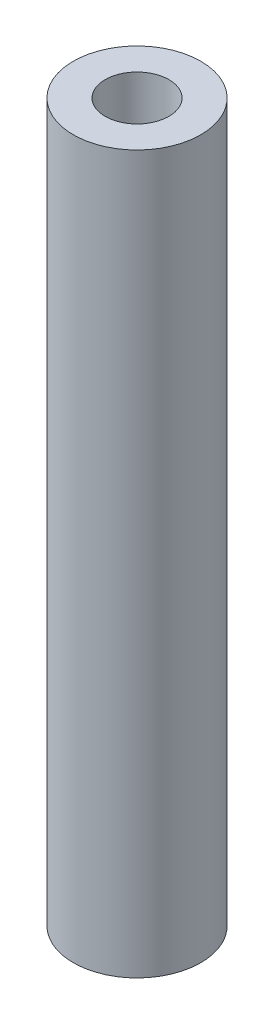
ISO-10303-21;
HEADER;
FILE_DESCRIPTION(('STEP AP214'),'2;1');
FILE_NAME('part.step','',(''),(''),'','','');
FILE_SCHEMA(('AUTOMOTIVE_DESIGN { 1 0 10303 214 1 1 1 1 }'));
ENDSEC;
DATA;
#1=APPLICATION_CONTEXT('core data for automotive mechanical design processes');
#2=APPLICATION_PROTOCOL_DEFINITION('international standard','automotive_design',2000,#1);
#3=PRODUCT_CONTEXT('',#1,'mechanical');
#4=PRODUCT('Part','Part','',(#3));
#5=PRODUCT_RELATED_PRODUCT_CATEGORY('part','',(#4));
#6=PRODUCT_DEFINITION_FORMATION('','',#4);
#7=PRODUCT_DEFINITION_CONTEXT('part definition',#1,'design');
#8=PRODUCT_DEFINITION('design','',#6,#7);
#9=PRODUCT_DEFINITION_SHAPE('','',#8);
#10=(LENGTH_UNIT() NAMED_UNIT(*) SI_UNIT(.MILLI.,.METRE.));
#11=(NAMED_UNIT(*) PLANE_ANGLE_UNIT() SI_UNIT($,.RADIAN.));
#12=(NAMED_UNIT(*) SI_UNIT($,.STERADIAN.) SOLID_ANGLE_UNIT());
#13=UNCERTAINTY_MEASURE_WITH_UNIT(LENGTH_MEASURE(1.E-05),#10,'distance_accuracy_value','');
#14=(GEOMETRIC_REPRESENTATION_CONTEXT(3) GLOBAL_UNCERTAINTY_ASSIGNED_CONTEXT((#13)) GLOBAL_UNIT_ASSIGNED_CONTEXT((#10,
#11,#12)) REPRESENTATION_CONTEXT('',''));
#15=CARTESIAN_POINT('',(0.,0.,0.));
#16=DIRECTION('',(0.,0.,1.));
#17=DIRECTION('',(1.,0.,0.));
#18=AXIS2_PLACEMENT_3D('',#15,#16,#17);
#19=CARTESIAN_POINT('',(0.,45.,0.));
#20=DIRECTION('',(0.,1.,0.));
#21=DIRECTION('',(0.,0.,1.));
#22=AXIS2_PLACEMENT_3D('',#19,#20,#21);
#23=PLANE('',#22);
#24=CARTESIAN_POINT('',(0.,45.,0.));
#25=DIRECTION('',(0.,1.,0.));
#26=DIRECTION('',(0.,0.,1.));
#27=AXIS2_PLACEMENT_3D('',#24,#25,#26);
#28=CIRCLE('',#27,4.);
#29=CARTESIAN_POINT('',(0.,45.,-4.));
#30=VERTEX_POINT('',#29);
#31=EDGE_CURVE('E10',#30,#30,#28,.T.);
#32=ORIENTED_EDGE('',*,*,#31,.T.);
#33=EDGE_LOOP('',(#32));
#34=FACE_BOUND('',#33,.T.);
#35=CARTESIAN_POINT('',(0.,45.,0.));
#36=DIRECTION('',(0.,1.,0.));
#37=DIRECTION('',(0.,0.,1.));
#38=AXIS2_PLACEMENT_3D('',#35,#36,#37);
#39=CIRCLE('',#38,2.);
#40=CARTESIAN_POINT('',(0.,45.,-2.));
#41=VERTEX_POINT('',#40);
#42=EDGE_CURVE('E42',#41,#41,#39,.T.);
#43=ORIENTED_EDGE('',*,*,#42,.F.);
#44=EDGE_LOOP('',(#43));
#45=FACE_BOUND('',#44,.T.);
#46=ADVANCED_FACE('F31',(#34,#45),#23,.T.);
#47=CARTESIAN_POINT('',(0.,0.,0.));
#48=DIRECTION('',(0.,1.,0.));
#49=DIRECTION('',(0.,0.,1.));
#50=AXIS2_PLACEMENT_3D('',#47,#48,#49);
#51=PLANE('',#50);
#52=CARTESIAN_POINT('',(0.,0.,0.));
#53=DIRECTION('',(0.,1.,0.));
#54=DIRECTION('',(0.,0.,1.));
#55=AXIS2_PLACEMENT_3D('',#52,#53,#54);
#56=CIRCLE('',#55,4.);
#57=CARTESIAN_POINT('',(0.,0.,-4.));
#58=VERTEX_POINT('',#57);
#59=EDGE_CURVE('E35',#58,#58,#56,.T.);
#60=ORIENTED_EDGE('',*,*,#59,.F.);
#61=EDGE_LOOP('',(#60));
#62=FACE_BOUND('',#61,.T.);
#63=CARTESIAN_POINT('',(0.,0.,0.));
#64=DIRECTION('',(0.,1.,0.));
#65=DIRECTION('',(0.,0.,1.));
#66=AXIS2_PLACEMENT_3D('',#63,#64,#65);
#67=CIRCLE('',#66,2.);
#68=CARTESIAN_POINT('',(0.,0.,-2.));
#69=VERTEX_POINT('',#68);
#70=EDGE_CURVE('E44',#69,#69,#67,.T.);
#71=ORIENTED_EDGE('',*,*,#70,.T.);
#72=EDGE_LOOP('',(#71));
#73=FACE_BOUND('',#72,.T.);
#74=ADVANCED_FACE('F54',(#62,#73),#51,.F.);
#75=CARTESIAN_POINT('',(0.,45.,0.));
#76=DIRECTION('',(0.,-1.,0.));
#77=DIRECTION('',(0.,0.,-1.));
#78=AXIS2_PLACEMENT_3D('',#75,#76,#77);
#79=CYLINDRICAL_SURFACE('',#78,4.);
#80=CARTESIAN_POINT('',(0.,45.,-4.));
#81=CARTESIAN_POINT('',(0.,44.53125,-4.));
#82=CARTESIAN_POINT('',(0.,44.0625,-4.));
#83=CARTESIAN_POINT('',(0.,43.125,-4.));
#84=CARTESIAN_POINT('',(0.,42.65625,-4.));
#85=CARTESIAN_POINT('',(0.,41.71875,-4.));
#86=CARTESIAN_POINT('',(0.,41.25,-4.));
#87=CARTESIAN_POINT('',(0.,40.3125,-4.));
#88=CARTESIAN_POINT('',(0.,39.84375,-4.));
#89=CARTESIAN_POINT('',(0.,38.90625,-4.));
#90=CARTESIAN_POINT('',(0.,38.4375,-4.));
#91=CARTESIAN_POINT('',(0.,37.5,-4.));
#92=CARTESIAN_POINT('',(0.,37.03125,-4.));
#93=CARTESIAN_POINT('',(0.,36.09375,-4.));
#94=CARTESIAN_POINT('',(0.,35.625,-4.));
#95=CARTESIAN_POINT('',(0.,34.6875,-4.));
#96=CARTESIAN_POINT('',(0.,34.21875,-4.));
#97=CARTESIAN_POINT('',(0.,33.28125,-4.));
#98=CARTESIAN_POINT('',(0.,32.8125,-4.));
#99=CARTESIAN_POINT('',(0.,31.875,-4.));
#100=CARTESIAN_POINT('',(0.,31.40625,-4.));
#101=CARTESIAN_POINT('',(0.,30.46875,-4.));
#102=CARTESIAN_POINT('',(0.,30.,-4.));
#103=CARTESIAN_POINT('',(0.,29.0625,-4.));
#104=CARTESIAN_POINT('',(0.,28.59375,-4.));
#105=CARTESIAN_POINT('',(0.,27.65625,-4.));
#106=CARTESIAN_POINT('',(0.,27.1875,-4.));
#107=CARTESIAN_POINT('',(0.,26.25,-4.));
#108=CARTESIAN_POINT('',(0.,25.78125,-4.));
#109=CARTESIAN_POINT('',(0.,24.84375,-4.));
#110=CARTESIAN_POINT('',(0.,24.375,-4.));
#111=CARTESIAN_POINT('',(0.,23.4375,-4.));
#112=CARTESIAN_POINT('',(0.,22.96875,-4.));
#113=CARTESIAN_POINT('',(0.,22.03125,-4.));
#114=CARTESIAN_POINT('',(0.,21.5625,-4.));
#115=CARTESIAN_POINT('',(0.,20.625,-4.));
#116=CARTESIAN_POINT('',(0.,20.15625,-4.));
#117=CARTESIAN_POINT('',(0.,19.21875,-4.));
#118=CARTESIAN_POINT('',(0.,18.75,-4.));
#119=CARTESIAN_POINT('',(0.,17.8125,-4.));
#120=CARTESIAN_POINT('',(0.,17.34375,-4.));
#121=CARTESIAN_POINT('',(0.,16.40625,-4.));
#122=CARTESIAN_POINT('',(0.,15.9375,-4.));
#123=CARTESIAN_POINT('',(0.,15.,-4.));
#124=CARTESIAN_POINT('',(0.,14.53125,-4.));
#125=CARTESIAN_POINT('',(0.,13.59375,-4.));
#126=CARTESIAN_POINT('',(0.,13.125,-4.));
#127=CARTESIAN_POINT('',(0.,12.1875,-4.));
#128=CARTESIAN_POINT('',(0.,11.71875,-4.));
#129=CARTESIAN_POINT('',(0.,10.78125,-4.));
#130=CARTESIAN_POINT('',(0.,10.3125,-4.));
#131=CARTESIAN_POINT('',(0.,9.37499999999999,-4.));
#132=CARTESIAN_POINT('',(0.,8.90624999999999,-4.));
#133=CARTESIAN_POINT('',(0.,7.96874999999999,-4.));
#134=CARTESIAN_POINT('',(0.,7.5,-4.));
#135=CARTESIAN_POINT('',(0.,6.56249999999999,-4.));
#136=CARTESIAN_POINT('',(0.,6.09374999999999,-4.));
#137=CARTESIAN_POINT('',(0.,5.15624999999999,-4.));
#138=CARTESIAN_POINT('',(0.,4.68749999999999,-4.));
#139=CARTESIAN_POINT('',(0.,3.74999999999999,-4.));
#140=CARTESIAN_POINT('',(0.,3.28124999999999,-4.));
#141=CARTESIAN_POINT('',(0.,2.34374999999999,-4.));
#142=CARTESIAN_POINT('',(0.,1.87499999999999,-4.));
#143=CARTESIAN_POINT('',(0.,0.937499999999992,-4.));
#144=CARTESIAN_POINT('',(0.,0.468749999999993,-4.));
#145=CARTESIAN_POINT('',(0.,0.,-4.));
#146=B_SPLINE_CURVE_WITH_KNOTS('',3,(#80,#81,#82,#83,#84,#85,#86,#87,#88,#89,#90,#91,#92,#93,
#94,#95,#96,#97,#98,#99,#100,#101,#102,#103,#104,#105,#106,#107,#108,#109,#110,#111,#112,#113,
#114,#115,#116,#117,#118,#119,#120,#121,#122,#123,#124,#125,#126,#127,#128,#129,#130,#131,#132,
#133,#134,#135,#136,#137,#138,#139,#140,#141,#142,#143,#144,#145),.UNSPECIFIED.,.F.,.F.,(4,2,2,
2,2,2,2,2,2,2,2,2,2,2,2,2,2,2,2,2,2,2,2,2,2,2,2,2,2,2,2,2,4),(0.,1.40625,2.8125,
4.21874999999999,5.625,7.03125,8.43749999999999,9.84375,11.25,12.65625,14.0625,15.46875,16.875,
18.28125,19.6875,21.09375,22.5,23.90625,25.3125,26.71875,28.125,29.53125,30.9375,32.34375,33.75,
35.15625,36.5625,37.96875,39.375,40.78125,42.1875,43.59375,45.),.UNSPECIFIED.);
#147=EDGE_CURVE('BSEAM33',#30,#58,#146,.T.);
#148=ORIENTED_EDGE('',*,*,#31,.F.);
#149=ORIENTED_EDGE('',*,*,#59,.T.);
#150=ORIENTED_EDGE('',*,*,#147,.T.);
#151=ORIENTED_EDGE('',*,*,#147,.F.);
#152=EDGE_LOOP('',(#148,#150,#149,#151));
#153=FACE_BOUND('',#152,.T.);
#154=ADVANCED_FACE('F33',(#153),#79,.T.);
#155=CARTESIAN_POINT('',(0.,45.,0.));
#156=DIRECTION('',(0.,-1.,0.));
#157=DIRECTION('',(0.,0.,-1.));
#158=AXIS2_PLACEMENT_3D('',#155,#156,#157);
#159=CYLINDRICAL_SURFACE('',#158,2.);
#160=CARTESIAN_POINT('',(0.,45.,-2.));
#161=CARTESIAN_POINT('',(0.,44.53125,-2.));
#162=CARTESIAN_POINT('',(0.,44.0625,-2.));
#163=CARTESIAN_POINT('',(0.,43.125,-2.));
#164=CARTESIAN_POINT('',(0.,42.65625,-2.));
#165=CARTESIAN_POINT('',(0.,41.71875,-2.));
#166=CARTESIAN_POINT('',(0.,41.25,-2.));
#167=CARTESIAN_POINT('',(0.,40.3125,-2.));
#168=CARTESIAN_POINT('',(0.,39.84375,-2.));
#169=CARTESIAN_POINT('',(0.,38.90625,-2.));
#170=CARTESIAN_POINT('',(0.,38.4375,-2.));
#171=CARTESIAN_POINT('',(0.,37.5,-2.));
#172=CARTESIAN_POINT('',(0.,37.03125,-2.));
#173=CARTESIAN_POINT('',(0.,36.09375,-2.));
#174=CARTESIAN_POINT('',(0.,35.625,-2.));
#175=CARTESIAN_POINT('',(0.,34.6875,-2.));
#176=CARTESIAN_POINT('',(0.,34.21875,-2.));
#177=CARTESIAN_POINT('',(0.,33.28125,-2.));
#178=CARTESIAN_POINT('',(0.,32.8125,-2.));
#179=CARTESIAN_POINT('',(0.,31.875,-2.));
#180=CARTESIAN_POINT('',(0.,31.40625,-2.));
#181=CARTESIAN_POINT('',(0.,30.46875,-2.));
#182=CARTESIAN_POINT('',(0.,30.,-2.));
#183=CARTESIAN_POINT('',(0.,29.0625,-2.));
#184=CARTESIAN_POINT('',(0.,28.59375,-2.));
#185=CARTESIAN_POINT('',(0.,27.65625,-2.));
#186=CARTESIAN_POINT('',(0.,27.1875,-2.));
#187=CARTESIAN_POINT('',(0.,26.25,-2.));
#188=CARTESIAN_POINT('',(0.,25.78125,-2.));
#189=CARTESIAN_POINT('',(0.,24.84375,-2.));
#190=CARTESIAN_POINT('',(0.,24.375,-2.));
#191=CARTESIAN_POINT('',(0.,23.4375,-2.));
#192=CARTESIAN_POINT('',(0.,22.96875,-2.));
#193=CARTESIAN_POINT('',(0.,22.03125,-2.));
#194=CARTESIAN_POINT('',(0.,21.5625,-2.));
#195=CARTESIAN_POINT('',(0.,20.625,-2.));
#196=CARTESIAN_POINT('',(0.,20.15625,-2.));
#197=CARTESIAN_POINT('',(0.,19.21875,-2.));
#198=CARTESIAN_POINT('',(0.,18.75,-2.));
#199=CARTESIAN_POINT('',(0.,17.8125,-2.));
#200=CARTESIAN_POINT('',(0.,17.34375,-2.));
#201=CARTESIAN_POINT('',(0.,16.40625,-2.));
#202=CARTESIAN_POINT('',(0.,15.9375,-2.));
#203=CARTESIAN_POINT('',(0.,15.,-2.));
#204=CARTESIAN_POINT('',(0.,14.53125,-2.));
#205=CARTESIAN_POINT('',(0.,13.59375,-2.));
#206=CARTESIAN_POINT('',(0.,13.125,-2.));
#207=CARTESIAN_POINT('',(0.,12.1875,-2.));
#208=CARTESIAN_POINT('',(0.,11.71875,-2.));
#209=CARTESIAN_POINT('',(0.,10.78125,-2.));
#210=CARTESIAN_POINT('',(0.,10.3125,-2.));
#211=CARTESIAN_POINT('',(0.,9.37499999999999,-2.));
#212=CARTESIAN_POINT('',(0.,8.90624999999999,-2.));
#213=CARTESIAN_POINT('',(0.,7.96874999999999,-2.));
#214=CARTESIAN_POINT('',(0.,7.5,-2.));
#215=CARTESIAN_POINT('',(0.,6.56249999999999,-2.));
#216=CARTESIAN_POINT('',(0.,6.09374999999999,-2.));
#217=CARTESIAN_POINT('',(0.,5.15624999999999,-2.));
#218=CARTESIAN_POINT('',(0.,4.68749999999999,-2.));
#219=CARTESIAN_POINT('',(0.,3.74999999999999,-2.));
#220=CARTESIAN_POINT('',(0.,3.28124999999999,-2.));
#221=CARTESIAN_POINT('',(0.,2.34374999999999,-2.));
#222=CARTESIAN_POINT('',(0.,1.87499999999999,-2.));
#223=CARTESIAN_POINT('',(0.,0.937499999999992,-2.));
#224=CARTESIAN_POINT('',(0.,0.468749999999993,-2.));
#225=CARTESIAN_POINT('',(0.,0.,-2.));
#226=B_SPLINE_CURVE_WITH_KNOTS('',3,(#160,#161,#162,#163,#164,#165,#166,#167,#168,#169,#170,
#171,#172,#173,#174,#175,#176,#177,#178,#179,#180,#181,#182,#183,#184,#185,#186,#187,#188,#189,
#190,#191,#192,#193,#194,#195,#196,#197,#198,#199,#200,#201,#202,#203,#204,#205,#206,#207,#208,
#209,#210,#211,#212,#213,#214,#215,#216,#217,#218,#219,#220,#221,#222,#223,#224,#225),
.UNSPECIFIED.,.F.,.F.,(4,2,2,2,2,2,2,2,2,2,2,2,2,2,2,2,2,2,2,2,2,2,2,2,2,2,2,2,2,2,2,2,4),(0.,
1.40625,2.8125,4.21874999999999,5.625,7.03125,8.43749999999999,9.84375,11.25,12.65625,14.0625,
15.46875,16.875,18.28125,19.6875,21.09375,22.5,23.90625,25.3125,26.71875,28.125,29.53125,
30.9375,32.34375,33.75,35.15625,36.5625,37.96875,39.375,40.78125,42.1875,43.59375,45.),.UNSPECIFIED.);
#227=EDGE_CURVE('BSEAM50',#41,#69,#226,.T.);
#228=ORIENTED_EDGE('',*,*,#42,.T.);
#229=ORIENTED_EDGE('',*,*,#70,.F.);
#230=ORIENTED_EDGE('',*,*,#227,.T.);
#231=ORIENTED_EDGE('',*,*,#227,.F.);
#232=EDGE_LOOP('',(#228,#230,#229,#231));
#233=FACE_BOUND('',#232,.T.);
#234=ADVANCED_FACE('F50',(#233),#159,.F.);
#235=CLOSED_SHELL('',(#46,#74,#154,#234));
#236=MANIFOLD_SOLID_BREP('B2',#235);
#237=ADVANCED_BREP_SHAPE_REPRESENTATION('',(#18,#236),#14);
#238=SHAPE_DEFINITION_REPRESENTATION(#9,#237);
ENDSEC;
END-ISO-10303-21;
